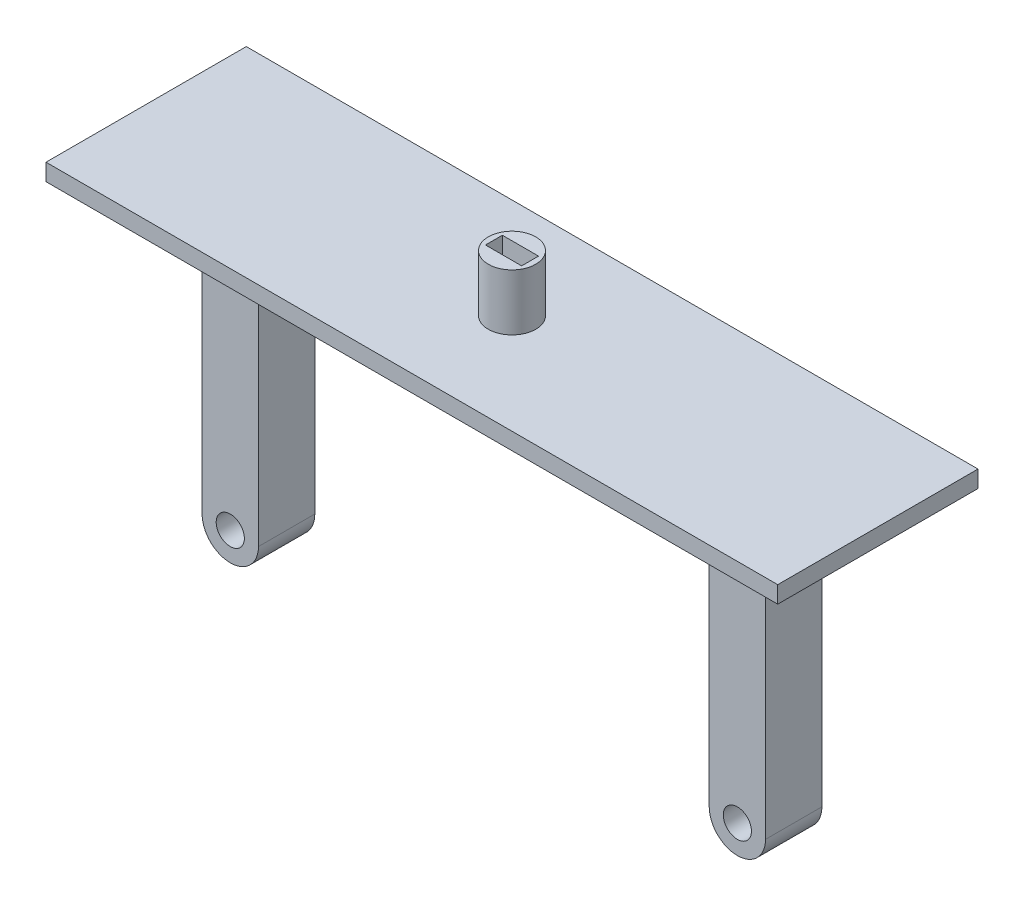
ISO-10303-21;
HEADER;
FILE_DESCRIPTION(('STEP AP214'),'2;1');
FILE_NAME('part.step','',(''),(''),'','','');
FILE_SCHEMA(('AUTOMOTIVE_DESIGN { 1 0 10303 214 1 1 1 1 }'));
ENDSEC;
DATA;
#1=APPLICATION_CONTEXT('core data for automotive mechanical design processes');
#2=APPLICATION_PROTOCOL_DEFINITION('international standard','automotive_design',2000,#1);
#3=PRODUCT_CONTEXT('',#1,'mechanical');
#4=PRODUCT('Part','Part','',(#3));
#5=PRODUCT_RELATED_PRODUCT_CATEGORY('part','',(#4));
#6=PRODUCT_DEFINITION_FORMATION('','',#4);
#7=PRODUCT_DEFINITION_CONTEXT('part definition',#1,'design');
#8=PRODUCT_DEFINITION('design','',#6,#7);
#9=PRODUCT_DEFINITION_SHAPE('','',#8);
#10=(LENGTH_UNIT() NAMED_UNIT(*) SI_UNIT(.MILLI.,.METRE.));
#11=(NAMED_UNIT(*) PLANE_ANGLE_UNIT() SI_UNIT($,.RADIAN.));
#12=(NAMED_UNIT(*) SI_UNIT($,.STERADIAN.) SOLID_ANGLE_UNIT());
#13=UNCERTAINTY_MEASURE_WITH_UNIT(LENGTH_MEASURE(1.E-05),#10,'distance_accuracy_value','');
#14=(GEOMETRIC_REPRESENTATION_CONTEXT(3) GLOBAL_UNCERTAINTY_ASSIGNED_CONTEXT((#13)) GLOBAL_UNIT_ASSIGNED_CONTEXT((#10,
#11,#12)) REPRESENTATION_CONTEXT('',''));
#15=CARTESIAN_POINT('',(0.,0.,0.));
#16=DIRECTION('',(0.,0.,1.));
#17=DIRECTION('',(1.,0.,0.));
#18=AXIS2_PLACEMENT_3D('',#15,#16,#17);
#19=CARTESIAN_POINT('',(0.,1.5,5.));
#20=DIRECTION('',(0.,-1.,0.));
#21=DIRECTION('',(1.,0.,0.));
#22=AXIS2_PLACEMENT_3D('',#19,#20,#21);
#23=PLANE('',#22);
#24=DIRECTION('',(0.,0.,1.));
#25=VECTOR('',#24,1.);
#26=CARTESIAN_POINT('',(-64.9334044040603,1.49999999999999,17.7727870518436));
#27=LINE('',#26,#25);
#28=CARTESIAN_POINT('',(-64.9334044040603,1.49999999999999,-17.7727870518436));
#29=VERTEX_POINT('',#28);
#30=CARTESIAN_POINT('',(-64.9334044040603,1.49999999999999,17.7727870518436));
#31=VERTEX_POINT('',#30);
#32=EDGE_CURVE('E268',#29,#31,#27,.T.);
#33=ORIENTED_EDGE('',*,*,#32,.T.);
#34=DIRECTION('',(1.,0.,0.));
#35=VECTOR('',#34,1.);
#36=CARTESIAN_POINT('',(64.9334044040603,1.50000000000001,17.7727870518436));
#37=LINE('',#36,#35);
#38=CARTESIAN_POINT('',(64.9334044040603,1.50000000000001,17.7727870518436));
#39=VERTEX_POINT('',#38);
#40=EDGE_CURVE('E264',#31,#39,#37,.T.);
#41=ORIENTED_EDGE('',*,*,#40,.T.);
#42=DIRECTION('',(0.,0.,-1.));
#43=VECTOR('',#42,1.);
#44=CARTESIAN_POINT('',(64.9334044040603,1.50000000000001,17.7727870518436));
#45=LINE('',#44,#43);
#46=CARTESIAN_POINT('',(64.9334044040603,1.50000000000001,-17.7727870518436));
#47=VERTEX_POINT('',#46);
#48=EDGE_CURVE('E260',#39,#47,#45,.T.);
#49=ORIENTED_EDGE('',*,*,#48,.T.);
#50=DIRECTION('',(-1.,0.,0.));
#51=VECTOR('',#50,1.);
#52=CARTESIAN_POINT('',(64.9334044040603,1.50000000000001,-17.7727870518436));
#53=LINE('',#52,#51);
#54=EDGE_CURVE('E255',#47,#29,#53,.T.);
#55=ORIENTED_EDGE('',*,*,#54,.T.);
#56=EDGE_LOOP('',(#33,#41,#49,#55));
#57=FACE_BOUND('',#56,.T.);
#58=CARTESIAN_POINT('',(0.,1.5,0.));
#59=DIRECTION('',(0.,-1.,0.));
#60=DIRECTION('',(1.,0.,0.));
#61=AXIS2_PLACEMENT_3D('',#58,#59,#60);
#62=CIRCLE('',#61,4.20913305788496);
#63=CARTESIAN_POINT('',(4.20913305788496,1.5,0.));
#64=VERTEX_POINT('',#63);
#65=EDGE_CURVE('E11',#64,#64,#62,.F.);
#66=ORIENTED_EDGE('',*,*,#65,.F.);
#67=EDGE_LOOP('',(#66));
#68=FACE_BOUND('',#67,.T.);
#69=ADVANCED_FACE('F41',(#57,#68),#23,.F.);
#70=CARTESIAN_POINT('',(0.,0.,5.));
#71=DIRECTION('',(0.,0.,1.));
#72=DIRECTION('',(1.,0.,0.));
#73=AXIS2_PLACEMENT_3D('',#70,#71,#72);
#74=PLANE('',#73);
#75=CARTESIAN_POINT('',(45.,-51.5,5.));
#76=DIRECTION('',(0.,0.,1.));
#77=DIRECTION('',(1.,0.,0.));
#78=AXIS2_PLACEMENT_3D('',#75,#76,#77);
#79=CIRCLE('',#78,2.5);
#80=CARTESIAN_POINT('',(47.5,-51.5,5.));
#81=VERTEX_POINT('',#80);
#82=EDGE_CURVE('E185',#81,#81,#79,.T.);
#83=ORIENTED_EDGE('',*,*,#82,.F.);
#84=EDGE_LOOP('',(#83));
#85=FACE_BOUND('',#84,.T.);
#86=DIRECTION('',(0.,-1.,0.));
#87=VECTOR('',#86,1.);
#88=CARTESIAN_POINT('',(50.,0.,5.));
#89=LINE('',#88,#87);
#90=CARTESIAN_POINT('',(50.,-1.49999999999999,5.));
#91=VERTEX_POINT('',#90);
#92=CARTESIAN_POINT('',(50.,-51.5,5.));
#93=VERTEX_POINT('',#92);
#94=EDGE_CURVE('E129',#91,#93,#89,.T.);
#95=ORIENTED_EDGE('',*,*,#94,.F.);
#96=DIRECTION('',(-1.,0.,0.));
#97=VECTOR('',#96,1.);
#98=CARTESIAN_POINT('',(0.,-1.5,5.));
#99=LINE('',#98,#97);
#100=CARTESIAN_POINT('',(40.,-1.5,5.));
#101=VERTEX_POINT('',#100);
#102=EDGE_CURVE('E163',#91,#101,#99,.T.);
#103=ORIENTED_EDGE('',*,*,#102,.T.);
#104=DIRECTION('',(0.,-1.,0.));
#105=VECTOR('',#104,1.);
#106=CARTESIAN_POINT('',(40.,0.,5.));
#107=LINE('',#106,#105);
#108=CARTESIAN_POINT('',(40.,-51.5,5.));
#109=VERTEX_POINT('',#108);
#110=EDGE_CURVE('E132',#101,#109,#107,.T.);
#111=ORIENTED_EDGE('',*,*,#110,.T.);
#112=CARTESIAN_POINT('',(45.,-51.5,5.));
#113=DIRECTION('',(0.,0.,1.));
#114=DIRECTION('',(1.,0.,0.));
#115=AXIS2_PLACEMENT_3D('',#112,#113,#114);
#116=CIRCLE('',#115,5.);
#117=EDGE_CURVE('E125',#109,#93,#116,.T.);
#118=ORIENTED_EDGE('',*,*,#117,.T.);
#119=EDGE_LOOP('',(#95,#103,#111,#118));
#120=FACE_BOUND('',#119,.T.);
#121=ADVANCED_FACE('F127',(#85,#120),#74,.T.);
#122=CARTESIAN_POINT('',(-45.,-51.5,5.));
#123=DIRECTION('',(0.,0.,1.));
#124=DIRECTION('',(1.,0.,0.));
#125=AXIS2_PLACEMENT_3D('',#122,#123,#124);
#126=CIRCLE('',#125,2.5);
#127=CARTESIAN_POINT('',(-42.5,-51.5,5.));
#128=VERTEX_POINT('',#127);
#129=EDGE_CURVE('E229',#128,#128,#126,.T.);
#130=ORIENTED_EDGE('',*,*,#129,.F.);
#131=EDGE_LOOP('',(#130));
#132=FACE_BOUND('',#131,.T.);
#133=DIRECTION('',(0.,-1.,0.));
#134=VECTOR('',#133,1.);
#135=CARTESIAN_POINT('',(-40.,0.,5.));
#136=LINE('',#135,#134);
#137=CARTESIAN_POINT('',(-40.,-1.50000000000001,5.));
#138=VERTEX_POINT('',#137);
#139=CARTESIAN_POINT('',(-40.,-51.5,5.));
#140=VERTEX_POINT('',#139);
#141=EDGE_CURVE('E218',#138,#140,#136,.T.);
#142=ORIENTED_EDGE('',*,*,#141,.F.);
#143=CARTESIAN_POINT('',(-50.,-1.50000000000001,5.));
#144=VERTEX_POINT('',#143);
#145=EDGE_CURVE('E66',#138,#144,#99,.T.);
#146=ORIENTED_EDGE('',*,*,#145,.T.);
#147=DIRECTION('',(0.,-1.,0.));
#148=VECTOR('',#147,1.);
#149=CARTESIAN_POINT('',(-50.,0.,5.));
#150=LINE('',#149,#148);
#151=CARTESIAN_POINT('',(-50.,-51.5,5.));
#152=VERTEX_POINT('',#151);
#153=EDGE_CURVE('E105',#144,#152,#150,.T.);
#154=ORIENTED_EDGE('',*,*,#153,.T.);
#155=CARTESIAN_POINT('',(-45.,-51.5,5.));
#156=DIRECTION('',(0.,0.,1.));
#157=DIRECTION('',(1.,0.,0.));
#158=AXIS2_PLACEMENT_3D('',#155,#156,#157);
#159=CIRCLE('',#158,4.99999999999999);
#160=EDGE_CURVE('E221',#140,#152,#159,.F.);
#161=ORIENTED_EDGE('',*,*,#160,.F.);
#162=EDGE_LOOP('',(#142,#146,#154,#161));
#163=FACE_BOUND('',#162,.T.);
#164=ADVANCED_FACE('F409',(#132,#163),#74,.T.);
#165=CARTESIAN_POINT('',(0.,0.,-5.));
#166=DIRECTION('',(0.,0.,1.));
#167=DIRECTION('',(1.,0.,0.));
#168=AXIS2_PLACEMENT_3D('',#165,#166,#167);
#169=PLANE('',#168);
#170=CARTESIAN_POINT('',(45.,-51.5,-5.));
#171=DIRECTION('',(0.,0.,1.));
#172=DIRECTION('',(1.,0.,0.));
#173=AXIS2_PLACEMENT_3D('',#170,#171,#172);
#174=CIRCLE('',#173,2.5);
#175=CARTESIAN_POINT('',(47.5,-51.5,-5.));
#176=VERTEX_POINT('',#175);
#177=EDGE_CURVE('E158',#176,#176,#174,.T.);
#178=ORIENTED_EDGE('',*,*,#177,.T.);
#179=EDGE_LOOP('',(#178));
#180=FACE_BOUND('',#179,.T.);
#181=DIRECTION('',(-1.,0.,0.));
#182=VECTOR('',#181,1.);
#183=CARTESIAN_POINT('',(0.,-1.5,-5.));
#184=LINE('',#183,#182);
#185=CARTESIAN_POINT('',(50.,-1.49999999999999,-5.));
#186=VERTEX_POINT('',#185);
#187=CARTESIAN_POINT('',(40.,-1.5,-5.));
#188=VERTEX_POINT('',#187);
#189=EDGE_CURVE('E50',#186,#188,#184,.T.);
#190=ORIENTED_EDGE('',*,*,#189,.F.);
#191=DIRECTION('',(0.,-1.,0.));
#192=VECTOR('',#191,1.);
#193=CARTESIAN_POINT('',(50.,0.,-5.));
#194=LINE('',#193,#192);
#195=CARTESIAN_POINT('',(50.,-51.5,-5.));
#196=VERTEX_POINT('',#195);
#197=EDGE_CURVE('E183',#186,#196,#194,.T.);
#198=ORIENTED_EDGE('',*,*,#197,.T.);
#199=CARTESIAN_POINT('',(45.,-51.5,-5.));
#200=DIRECTION('',(0.,0.,1.));
#201=DIRECTION('',(1.,0.,0.));
#202=AXIS2_PLACEMENT_3D('',#199,#200,#201);
#203=CIRCLE('',#202,5.);
#204=CARTESIAN_POINT('',(40.,-51.5,-5.));
#205=VERTEX_POINT('',#204);
#206=EDGE_CURVE('E142',#205,#196,#203,.T.);
#207=ORIENTED_EDGE('',*,*,#206,.F.);
#208=DIRECTION('',(0.,-1.,0.));
#209=VECTOR('',#208,1.);
#210=CARTESIAN_POINT('',(40.,0.,-5.));
#211=LINE('',#210,#209);
#212=EDGE_CURVE('E178',#188,#205,#211,.T.);
#213=ORIENTED_EDGE('',*,*,#212,.F.);
#214=EDGE_LOOP('',(#190,#198,#207,#213));
#215=FACE_BOUND('',#214,.T.);
#216=ADVANCED_FACE('F214',(#180,#215),#169,.F.);
#217=CARTESIAN_POINT('',(-45.,-51.5,-5.));
#218=DIRECTION('',(0.,0.,1.));
#219=DIRECTION('',(1.,0.,0.));
#220=AXIS2_PLACEMENT_3D('',#217,#218,#219);
#221=CIRCLE('',#220,2.5);
#222=CARTESIAN_POINT('',(-42.5,-51.5,-5.));
#223=VERTEX_POINT('',#222);
#224=EDGE_CURVE('E162',#223,#223,#221,.T.);
#225=ORIENTED_EDGE('',*,*,#224,.T.);
#226=EDGE_LOOP('',(#225));
#227=FACE_BOUND('',#226,.T.);
#228=CARTESIAN_POINT('',(-40.,-1.50000000000001,-5.));
#229=VERTEX_POINT('',#228);
#230=CARTESIAN_POINT('',(-50.,-1.50000000000001,-5.));
#231=VERTEX_POINT('',#230);
#232=EDGE_CURVE('E203',#229,#231,#184,.T.);
#233=ORIENTED_EDGE('',*,*,#232,.F.);
#234=DIRECTION('',(0.,-1.,0.));
#235=VECTOR('',#234,1.);
#236=CARTESIAN_POINT('',(-40.,0.,-5.));
#237=LINE('',#236,#235);
#238=CARTESIAN_POINT('',(-40.,-51.5,-5.));
#239=VERTEX_POINT('',#238);
#240=EDGE_CURVE('E174',#229,#239,#237,.T.);
#241=ORIENTED_EDGE('',*,*,#240,.T.);
#242=CARTESIAN_POINT('',(-45.,-51.5,-5.));
#243=DIRECTION('',(0.,0.,1.));
#244=DIRECTION('',(1.,0.,0.));
#245=AXIS2_PLACEMENT_3D('',#242,#243,#244);
#246=CIRCLE('',#245,4.99999999999999);
#247=CARTESIAN_POINT('',(-50.,-51.5,-5.));
#248=VERTEX_POINT('',#247);
#249=EDGE_CURVE('E170',#239,#248,#246,.F.);
#250=ORIENTED_EDGE('',*,*,#249,.T.);
#251=DIRECTION('',(0.,-1.,0.));
#252=VECTOR('',#251,1.);
#253=CARTESIAN_POINT('',(-50.,0.,-5.));
#254=LINE('',#253,#252);
#255=EDGE_CURVE('E167',#231,#248,#254,.T.);
#256=ORIENTED_EDGE('',*,*,#255,.F.);
#257=EDGE_LOOP('',(#233,#241,#250,#256));
#258=FACE_BOUND('',#257,.T.);
#259=ADVANCED_FACE('F432',(#227,#258),#169,.F.);
#260=CARTESIAN_POINT('',(-50.,0.,5.));
#261=DIRECTION('',(1.,0.,0.));
#262=DIRECTION('',(0.,1.,0.));
#263=AXIS2_PLACEMENT_3D('',#260,#261,#262);
#264=PLANE('',#263);
#265=ORIENTED_EDGE('',*,*,#255,.T.);
#266=DIRECTION('',(0.,0.,-1.));
#267=VECTOR('',#266,1.);
#268=CARTESIAN_POINT('',(-50.,-51.5,5.));
#269=LINE('',#268,#267);
#270=EDGE_CURVE('E201',#152,#248,#269,.T.);
#271=ORIENTED_EDGE('',*,*,#270,.F.);
#272=ORIENTED_EDGE('',*,*,#153,.F.);
#273=DIRECTION('',(0.,0.,-1.));
#274=VECTOR('',#273,1.);
#275=CARTESIAN_POINT('',(-50.,-1.50000000000001,5.));
#276=LINE('',#275,#274);
#277=EDGE_CURVE('E100',#144,#231,#276,.T.);
#278=ORIENTED_EDGE('',*,*,#277,.T.);
#279=EDGE_LOOP('',(#265,#271,#272,#278));
#280=FACE_BOUND('',#279,.T.);
#281=ADVANCED_FACE('F429',(#280),#264,.F.);
#282=CARTESIAN_POINT('',(-45.,-51.5,5.));
#283=DIRECTION('',(0.,0.,-1.));
#284=DIRECTION('',(-1.,0.,0.));
#285=AXIS2_PLACEMENT_3D('',#282,#283,#284);
#286=CYLINDRICAL_SURFACE('',#285,4.99999999999999);
#287=ORIENTED_EDGE('',*,*,#249,.F.);
#288=DIRECTION('',(0.,0.,-1.));
#289=VECTOR('',#288,1.);
#290=CARTESIAN_POINT('',(-40.,-51.5,5.));
#291=LINE('',#290,#289);
#292=EDGE_CURVE('E198',#140,#239,#291,.T.);
#293=ORIENTED_EDGE('',*,*,#292,.F.);
#294=ORIENTED_EDGE('',*,*,#160,.T.);
#295=ORIENTED_EDGE('',*,*,#270,.T.);
#296=EDGE_LOOP('',(#287,#293,#294,#295));
#297=FACE_BOUND('',#296,.T.);
#298=ADVANCED_FACE('F425',(#297),#286,.T.);
#299=CARTESIAN_POINT('',(-40.,0.,5.));
#300=DIRECTION('',(1.,0.,0.));
#301=DIRECTION('',(0.,0.,-1.));
#302=AXIS2_PLACEMENT_3D('',#299,#300,#301);
#303=PLANE('',#302);
#304=ORIENTED_EDGE('',*,*,#240,.F.);
#305=DIRECTION('',(0.,0.,-1.));
#306=VECTOR('',#305,1.);
#307=CARTESIAN_POINT('',(-40.,-1.50000000000001,5.));
#308=LINE('',#307,#306);
#309=EDGE_CURVE('E194',#138,#229,#308,.T.);
#310=ORIENTED_EDGE('',*,*,#309,.F.);
#311=ORIENTED_EDGE('',*,*,#141,.T.);
#312=ORIENTED_EDGE('',*,*,#292,.T.);
#313=EDGE_LOOP('',(#304,#310,#311,#312));
#314=FACE_BOUND('',#313,.T.);
#315=ADVANCED_FACE('F422',(#314),#303,.T.);
#316=CARTESIAN_POINT('',(40.,0.,5.));
#317=DIRECTION('',(1.,0.,0.));
#318=DIRECTION('',(0.,1.,0.));
#319=AXIS2_PLACEMENT_3D('',#316,#317,#318);
#320=PLANE('',#319);
#321=ORIENTED_EDGE('',*,*,#212,.T.);
#322=DIRECTION('',(0.,0.,-1.));
#323=VECTOR('',#322,1.);
#324=CARTESIAN_POINT('',(40.,-51.5,5.));
#325=LINE('',#324,#323);
#326=EDGE_CURVE('E147',#109,#205,#325,.T.);
#327=ORIENTED_EDGE('',*,*,#326,.F.);
#328=ORIENTED_EDGE('',*,*,#110,.F.);
#329=DIRECTION('',(0.,0.,-1.));
#330=VECTOR('',#329,1.);
#331=CARTESIAN_POINT('',(40.,-1.5,5.));
#332=LINE('',#331,#330);
#333=EDGE_CURVE('E191',#101,#188,#332,.T.);
#334=ORIENTED_EDGE('',*,*,#333,.T.);
#335=EDGE_LOOP('',(#321,#327,#328,#334));
#336=FACE_BOUND('',#335,.T.);
#337=ADVANCED_FACE('F216',(#336),#320,.F.);
#338=CARTESIAN_POINT('',(45.,-51.5,5.));
#339=DIRECTION('',(0.,0.,-1.));
#340=DIRECTION('',(-1.,0.,0.));
#341=AXIS2_PLACEMENT_3D('',#338,#339,#340);
#342=CYLINDRICAL_SURFACE('',#341,5.);
#343=ORIENTED_EDGE('',*,*,#206,.T.);
#344=DIRECTION('',(0.,0.,-1.));
#345=VECTOR('',#344,1.);
#346=CARTESIAN_POINT('',(50.,-51.5,5.));
#347=LINE('',#346,#345);
#348=EDGE_CURVE('E139',#93,#196,#347,.T.);
#349=ORIENTED_EDGE('',*,*,#348,.F.);
#350=ORIENTED_EDGE('',*,*,#117,.F.);
#351=ORIENTED_EDGE('',*,*,#326,.T.);
#352=EDGE_LOOP('',(#343,#349,#350,#351));
#353=FACE_BOUND('',#352,.T.);
#354=ADVANCED_FACE('F140',(#353),#342,.T.);
#355=CARTESIAN_POINT('',(50.,0.,5.));
#356=DIRECTION('',(1.,0.,0.));
#357=DIRECTION('',(0.,0.,-1.));
#358=AXIS2_PLACEMENT_3D('',#355,#356,#357);
#359=PLANE('',#358);
#360=ORIENTED_EDGE('',*,*,#197,.F.);
#361=DIRECTION('',(0.,0.,-1.));
#362=VECTOR('',#361,1.);
#363=CARTESIAN_POINT('',(50.,-1.49999999999999,5.));
#364=LINE('',#363,#362);
#365=EDGE_CURVE('E148',#91,#186,#364,.T.);
#366=ORIENTED_EDGE('',*,*,#365,.F.);
#367=ORIENTED_EDGE('',*,*,#94,.T.);
#368=ORIENTED_EDGE('',*,*,#348,.T.);
#369=EDGE_LOOP('',(#360,#366,#367,#368));
#370=FACE_BOUND('',#369,.T.);
#371=ADVANCED_FACE('F150',(#370),#359,.T.);
#372=CARTESIAN_POINT('',(-45.,-51.5,5.));
#373=DIRECTION('',(0.,0.,-1.));
#374=DIRECTION('',(-1.,0.,0.));
#375=AXIS2_PLACEMENT_3D('',#372,#373,#374);
#376=CYLINDRICAL_SURFACE('',#375,2.5);
#377=ORIENTED_EDGE('',*,*,#129,.T.);
#378=EDGE_LOOP('',(#377));
#379=FACE_BOUND('',#378,.T.);
#380=ORIENTED_EDGE('',*,*,#224,.F.);
#381=EDGE_LOOP('',(#380));
#382=FACE_BOUND('',#381,.T.);
#383=ADVANCED_FACE('F417',(#379,#382),#376,.F.);
#384=CARTESIAN_POINT('',(45.,-51.5,5.));
#385=DIRECTION('',(0.,0.,-1.));
#386=DIRECTION('',(-1.,0.,0.));
#387=AXIS2_PLACEMENT_3D('',#384,#385,#386);
#388=CYLINDRICAL_SURFACE('',#387,2.5);
#389=ORIENTED_EDGE('',*,*,#82,.T.);
#390=EDGE_LOOP('',(#389));
#391=FACE_BOUND('',#390,.T.);
#392=ORIENTED_EDGE('',*,*,#177,.F.);
#393=EDGE_LOOP('',(#392));
#394=FACE_BOUND('',#393,.T.);
#395=ADVANCED_FACE('F43',(#391,#394),#388,.F.);
#396=CARTESIAN_POINT('',(0.,-1.5,5.));
#397=DIRECTION('',(0.,-1.,0.));
#398=DIRECTION('',(1.,0.,0.));
#399=AXIS2_PLACEMENT_3D('',#396,#397,#398);
#400=PLANE('',#399);
#401=DIRECTION('',(0.,0.,-1.));
#402=VECTOR('',#401,1.);
#403=CARTESIAN_POINT('',(-3.21,-1.5,5.));
#404=LINE('',#403,#402);
#405=CARTESIAN_POINT('',(-3.21,-1.5,1.5));
#406=VERTEX_POINT('',#405);
#407=CARTESIAN_POINT('',(-3.21,-1.5,-1.5));
#408=VERTEX_POINT('',#407);
#409=EDGE_CURVE('E272',#406,#408,#404,.T.);
#410=ORIENTED_EDGE('',*,*,#409,.F.);
#411=DIRECTION('',(-1.,0.,0.));
#412=VECTOR('',#411,1.);
#413=CARTESIAN_POINT('',(0.,-1.5,1.5));
#414=LINE('',#413,#412);
#415=CARTESIAN_POINT('',(3.21000000000001,-1.5,1.5));
#416=VERTEX_POINT('',#415);
#417=EDGE_CURVE('E297',#416,#406,#414,.T.);
#418=ORIENTED_EDGE('',*,*,#417,.F.);
#419=DIRECTION('',(0.,0.,1.));
#420=VECTOR('',#419,1.);
#421=CARTESIAN_POINT('',(3.21,-1.5,5.));
#422=LINE('',#421,#420);
#423=CARTESIAN_POINT('',(3.21,-1.5,-1.5));
#424=VERTEX_POINT('',#423);
#425=EDGE_CURVE('E294',#424,#416,#422,.T.);
#426=ORIENTED_EDGE('',*,*,#425,.F.);
#427=DIRECTION('',(1.,0.,0.));
#428=VECTOR('',#427,1.);
#429=CARTESIAN_POINT('',(0.,-1.5,-1.5));
#430=LINE('',#429,#428);
#431=EDGE_CURVE('E290',#408,#424,#430,.T.);
#432=ORIENTED_EDGE('',*,*,#431,.F.);
#433=EDGE_LOOP('',(#410,#418,#426,#432));
#434=FACE_BOUND('',#433,.T.);
#435=ORIENTED_EDGE('',*,*,#102,.F.);
#436=ORIENTED_EDGE('',*,*,#365,.T.);
#437=ORIENTED_EDGE('',*,*,#189,.T.);
#438=ORIENTED_EDGE('',*,*,#333,.F.);
#439=EDGE_LOOP('',(#435,#436,#437,#438));
#440=FACE_BOUND('',#439,.T.);
#441=ORIENTED_EDGE('',*,*,#145,.F.);
#442=ORIENTED_EDGE('',*,*,#309,.T.);
#443=ORIENTED_EDGE('',*,*,#232,.T.);
#444=ORIENTED_EDGE('',*,*,#277,.F.);
#445=EDGE_LOOP('',(#441,#442,#443,#444));
#446=FACE_BOUND('',#445,.T.);
#447=DIRECTION('',(0.,0.,1.));
#448=VECTOR('',#447,1.);
#449=CARTESIAN_POINT('',(-64.9334044040603,-1.50000000000001,17.7727870518436));
#450=LINE('',#449,#448);
#451=CARTESIAN_POINT('',(-64.9334044040603,-1.50000000000001,-17.7727870518436));
#452=VERTEX_POINT('',#451);
#453=CARTESIAN_POINT('',(-64.9334044040603,-1.50000000000001,17.7727870518436));
#454=VERTEX_POINT('',#453);
#455=EDGE_CURVE('E259',#452,#454,#450,.T.);
#456=ORIENTED_EDGE('',*,*,#455,.F.);
#457=DIRECTION('',(-1.,0.,0.));
#458=VECTOR('',#457,1.);
#459=CARTESIAN_POINT('',(64.9334044040603,-1.49999999999999,-17.7727870518436));
#460=LINE('',#459,#458);
#461=CARTESIAN_POINT('',(64.9334044040603,-1.49999999999999,-17.7727870518436));
#462=VERTEX_POINT('',#461);
#463=EDGE_CURVE('E243',#462,#452,#460,.T.);
#464=ORIENTED_EDGE('',*,*,#463,.F.);
#465=DIRECTION('',(0.,0.,-1.));
#466=VECTOR('',#465,1.);
#467=CARTESIAN_POINT('',(64.9334044040603,-1.49999999999999,17.7727870518436));
#468=LINE('',#467,#466);
#469=CARTESIAN_POINT('',(64.9334044040603,-1.49999999999999,17.7727870518436));
#470=VERTEX_POINT('',#469);
#471=EDGE_CURVE('E276',#470,#462,#468,.T.);
#472=ORIENTED_EDGE('',*,*,#471,.F.);
#473=DIRECTION('',(1.,0.,0.));
#474=VECTOR('',#473,1.);
#475=CARTESIAN_POINT('',(64.9334044040603,-1.49999999999999,17.7727870518436));
#476=LINE('',#475,#474);
#477=EDGE_CURVE('E280',#454,#470,#476,.T.);
#478=ORIENTED_EDGE('',*,*,#477,.F.);
#479=EDGE_LOOP('',(#456,#464,#472,#478));
#480=FACE_BOUND('',#479,.T.);
#481=ADVANCED_FACE('F211',(#434,#440,#446,#480),#400,.T.);
#482=CARTESIAN_POINT('',(-64.9334044040603,-1.50000000000001,17.7727870518436));
#483=DIRECTION('',(-1.,0.,0.));
#484=DIRECTION('',(0.,-1.,0.));
#485=AXIS2_PLACEMENT_3D('',#482,#483,#484);
#486=PLANE('',#485);
#487=ORIENTED_EDGE('',*,*,#32,.F.);
#488=DIRECTION('',(0.,1.,0.));
#489=VECTOR('',#488,1.);
#490=CARTESIAN_POINT('',(-64.9334044040603,-1.50000000000001,-17.7727870518436));
#491=LINE('',#490,#489);
#492=EDGE_CURVE('E251',#452,#29,#491,.T.);
#493=ORIENTED_EDGE('',*,*,#492,.F.);
#494=ORIENTED_EDGE('',*,*,#455,.T.);
#495=DIRECTION('',(0.,1.,0.));
#496=VECTOR('',#495,1.);
#497=CARTESIAN_POINT('',(-64.9334044040603,-1.50000000000001,17.7727870518436));
#498=LINE('',#497,#496);
#499=EDGE_CURVE('E238',#454,#31,#498,.T.);
#500=ORIENTED_EDGE('',*,*,#499,.T.);
#501=EDGE_LOOP('',(#487,#493,#494,#500));
#502=FACE_BOUND('',#501,.T.);
#503=ADVANCED_FACE('F384',(#502),#486,.T.);
#504=CARTESIAN_POINT('',(64.9334044040603,-1.49999999999999,-17.7727870518436));
#505=DIRECTION('',(0.,0.,-1.));
#506=DIRECTION('',(-1.,0.,0.));
#507=AXIS2_PLACEMENT_3D('',#504,#505,#506);
#508=PLANE('',#507);
#509=ORIENTED_EDGE('',*,*,#54,.F.);
#510=DIRECTION('',(0.,1.,0.));
#511=VECTOR('',#510,1.);
#512=CARTESIAN_POINT('',(64.9334044040603,-1.49999999999999,-17.7727870518436));
#513=LINE('',#512,#511);
#514=EDGE_CURVE('E247',#462,#47,#513,.T.);
#515=ORIENTED_EDGE('',*,*,#514,.F.);
#516=ORIENTED_EDGE('',*,*,#463,.T.);
#517=ORIENTED_EDGE('',*,*,#492,.T.);
#518=EDGE_LOOP('',(#509,#515,#516,#517));
#519=FACE_BOUND('',#518,.T.);
#520=ADVANCED_FACE('F380',(#519),#508,.T.);
#521=CARTESIAN_POINT('',(64.9334044040603,-1.49999999999999,17.7727870518436));
#522=DIRECTION('',(1.,0.,0.));
#523=DIRECTION('',(0.,1.,0.));
#524=AXIS2_PLACEMENT_3D('',#521,#522,#523);
#525=PLANE('',#524);
#526=ORIENTED_EDGE('',*,*,#48,.F.);
#527=DIRECTION('',(0.,1.,0.));
#528=VECTOR('',#527,1.);
#529=CARTESIAN_POINT('',(64.9334044040603,-1.49999999999999,17.7727870518436));
#530=LINE('',#529,#528);
#531=EDGE_CURVE('E242',#470,#39,#530,.T.);
#532=ORIENTED_EDGE('',*,*,#531,.F.);
#533=ORIENTED_EDGE('',*,*,#471,.T.);
#534=ORIENTED_EDGE('',*,*,#514,.T.);
#535=EDGE_LOOP('',(#526,#532,#533,#534));
#536=FACE_BOUND('',#535,.T.);
#537=ADVANCED_FACE('F388',(#536),#525,.T.);
#538=CARTESIAN_POINT('',(64.9334044040603,-1.49999999999999,17.7727870518436));
#539=DIRECTION('',(0.,0.,1.));
#540=DIRECTION('',(1.,0.,0.));
#541=AXIS2_PLACEMENT_3D('',#538,#539,#540);
#542=PLANE('',#541);
#543=ORIENTED_EDGE('',*,*,#40,.F.);
#544=ORIENTED_EDGE('',*,*,#499,.F.);
#545=ORIENTED_EDGE('',*,*,#477,.T.);
#546=ORIENTED_EDGE('',*,*,#531,.T.);
#547=EDGE_LOOP('',(#543,#544,#545,#546));
#548=FACE_BOUND('',#547,.T.);
#549=ADVANCED_FACE('F393',(#548),#542,.T.);
#550=CARTESIAN_POINT('',(-3.20999999999999,-56.5,1.5));
#551=DIRECTION('',(-1.,0.,0.));
#552=DIRECTION('',(0.,-1.,0.));
#553=AXIS2_PLACEMENT_3D('',#550,#551,#552);
#554=PLANE('',#553);
#555=ORIENTED_EDGE('',*,*,#409,.T.);
#556=DIRECTION('',(0.,1.,0.));
#557=VECTOR('',#556,1.);
#558=CARTESIAN_POINT('',(-3.20999999999999,-56.5,-1.5));
#559=LINE('',#558,#557);
#560=CARTESIAN_POINT('',(-3.21,11.5,-1.5));
#561=VERTEX_POINT('',#560);
#562=EDGE_CURVE('E300',#408,#561,#559,.T.);
#563=ORIENTED_EDGE('',*,*,#562,.T.);
#564=DIRECTION('',(0.,0.,1.));
#565=VECTOR('',#564,1.);
#566=CARTESIAN_POINT('',(-3.21,11.5,1.5));
#567=LINE('',#566,#565);
#568=CARTESIAN_POINT('',(-3.21,11.5,1.5));
#569=VERTEX_POINT('',#568);
#570=EDGE_CURVE('E329',#561,#569,#567,.T.);
#571=ORIENTED_EDGE('',*,*,#570,.T.);
#572=DIRECTION('',(0.,1.,0.));
#573=VECTOR('',#572,1.);
#574=CARTESIAN_POINT('',(-3.20999999999999,-56.5,1.5));
#575=LINE('',#574,#573);
#576=EDGE_CURVE('E301',#406,#569,#575,.T.);
#577=ORIENTED_EDGE('',*,*,#576,.F.);
#578=EDGE_LOOP('',(#555,#563,#571,#577));
#579=FACE_BOUND('',#578,.T.);
#580=ADVANCED_FACE('F337',(#579),#554,.F.);
#581=CARTESIAN_POINT('',(3.21000000000001,-56.5,-1.5));
#582=DIRECTION('',(0.,0.,-1.));
#583=DIRECTION('',(-1.,0.,0.));
#584=AXIS2_PLACEMENT_3D('',#581,#582,#583);
#585=PLANE('',#584);
#586=ORIENTED_EDGE('',*,*,#431,.T.);
#587=DIRECTION('',(0.,1.,0.));
#588=VECTOR('',#587,1.);
#589=CARTESIAN_POINT('',(3.21000000000001,-56.5,-1.5));
#590=LINE('',#589,#588);
#591=CARTESIAN_POINT('',(3.21,11.5,-1.5));
#592=VERTEX_POINT('',#591);
#593=EDGE_CURVE('E308',#424,#592,#590,.T.);
#594=ORIENTED_EDGE('',*,*,#593,.T.);
#595=DIRECTION('',(-1.,0.,0.));
#596=VECTOR('',#595,1.);
#597=CARTESIAN_POINT('',(3.21,11.5,-1.5));
#598=LINE('',#597,#596);
#599=EDGE_CURVE('E318',#592,#561,#598,.T.);
#600=ORIENTED_EDGE('',*,*,#599,.T.);
#601=ORIENTED_EDGE('',*,*,#562,.F.);
#602=EDGE_LOOP('',(#586,#594,#600,#601));
#603=FACE_BOUND('',#602,.T.);
#604=ADVANCED_FACE('F400',(#603),#585,.F.);
#605=CARTESIAN_POINT('',(3.21000000000001,-56.5,1.5));
#606=DIRECTION('',(1.,0.,0.));
#607=DIRECTION('',(0.,1.,0.));
#608=AXIS2_PLACEMENT_3D('',#605,#606,#607);
#609=PLANE('',#608);
#610=ORIENTED_EDGE('',*,*,#425,.T.);
#611=DIRECTION('',(0.,1.,0.));
#612=VECTOR('',#611,1.);
#613=CARTESIAN_POINT('',(3.21000000000001,-56.5,1.5));
#614=LINE('',#613,#612);
#615=CARTESIAN_POINT('',(3.21,11.5,1.5));
#616=VERTEX_POINT('',#615);
#617=EDGE_CURVE('E57',#416,#616,#614,.T.);
#618=ORIENTED_EDGE('',*,*,#617,.T.);
#619=DIRECTION('',(0.,0.,-1.));
#620=VECTOR('',#619,1.);
#621=CARTESIAN_POINT('',(3.21,11.5,1.5));
#622=LINE('',#621,#620);
#623=EDGE_CURVE('E322',#616,#592,#622,.T.);
#624=ORIENTED_EDGE('',*,*,#623,.T.);
#625=ORIENTED_EDGE('',*,*,#593,.F.);
#626=EDGE_LOOP('',(#610,#618,#624,#625));
#627=FACE_BOUND('',#626,.T.);
#628=ADVANCED_FACE('F467',(#627),#609,.F.);
#629=CARTESIAN_POINT('',(3.21000000000001,-56.5,1.5));
#630=DIRECTION('',(0.,0.,1.));
#631=DIRECTION('',(1.,0.,0.));
#632=AXIS2_PLACEMENT_3D('',#629,#630,#631);
#633=PLANE('',#632);
#634=ORIENTED_EDGE('',*,*,#417,.T.);
#635=ORIENTED_EDGE('',*,*,#576,.T.);
#636=DIRECTION('',(1.,0.,0.));
#637=VECTOR('',#636,1.);
#638=CARTESIAN_POINT('',(3.21,11.5,1.5));
#639=LINE('',#638,#637);
#640=EDGE_CURVE('E326',#569,#616,#639,.T.);
#641=ORIENTED_EDGE('',*,*,#640,.T.);
#642=ORIENTED_EDGE('',*,*,#617,.F.);
#643=EDGE_LOOP('',(#634,#635,#641,#642));
#644=FACE_BOUND('',#643,.T.);
#645=ADVANCED_FACE('F348',(#644),#633,.F.);
#646=CARTESIAN_POINT('',(0.,11.5,0.));
#647=DIRECTION('',(0.,1.,0.));
#648=DIRECTION('',(-1.,0.,0.));
#649=AXIS2_PLACEMENT_3D('',#646,#647,#648);
#650=PLANE('',#649);
#651=CARTESIAN_POINT('',(0.,11.5,0.));
#652=DIRECTION('',(0.,1.,0.));
#653=DIRECTION('',(-1.,0.,0.));
#654=AXIS2_PLACEMENT_3D('',#651,#652,#653);
#655=CIRCLE('',#654,4.20913305788496);
#656=CARTESIAN_POINT('',(-4.20913305788496,11.5,0.));
#657=VERTEX_POINT('',#656);
#658=EDGE_CURVE('E305',#657,#657,#655,.T.);
#659=ORIENTED_EDGE('',*,*,#658,.T.);
#660=EDGE_LOOP('',(#659));
#661=FACE_BOUND('',#660,.T.);
#662=ORIENTED_EDGE('',*,*,#640,.F.);
#663=ORIENTED_EDGE('',*,*,#570,.F.);
#664=ORIENTED_EDGE('',*,*,#599,.F.);
#665=ORIENTED_EDGE('',*,*,#623,.F.);
#666=EDGE_LOOP('',(#662,#663,#664,#665));
#667=FACE_BOUND('',#666,.T.);
#668=ADVANCED_FACE('F347',(#661,#667),#650,.T.);
#669=CARTESIAN_POINT('',(0.,11.5,0.));
#670=DIRECTION('',(0.,-1.,0.));
#671=DIRECTION('',(1.,0.,0.));
#672=AXIS2_PLACEMENT_3D('',#669,#670,#671);
#673=CYLINDRICAL_SURFACE('',#672,4.20913305788496);
#674=ORIENTED_EDGE('',*,*,#658,.F.);
#675=EDGE_LOOP('',(#674));
#676=FACE_BOUND('',#675,.T.);
#677=ORIENTED_EDGE('',*,*,#65,.T.);
#678=EDGE_LOOP('',(#677));
#679=FACE_BOUND('',#678,.T.);
#680=ADVANCED_FACE('F477',(#676,#679),#673,.T.);
#681=CLOSED_SHELL('',(#69,#121,#164,#216,#259,#281,#298,#315,#337,#354,#371,#383,#395,#481,#503,
#520,#537,#549,#580,#604,#628,#645,#668,#680));
#682=MANIFOLD_SOLID_BREP('B2',#681);
#683=ADVANCED_BREP_SHAPE_REPRESENTATION('',(#18,#682),#14);
#684=SHAPE_DEFINITION_REPRESENTATION(#9,#683);
ENDSEC;
END-ISO-10303-21;
